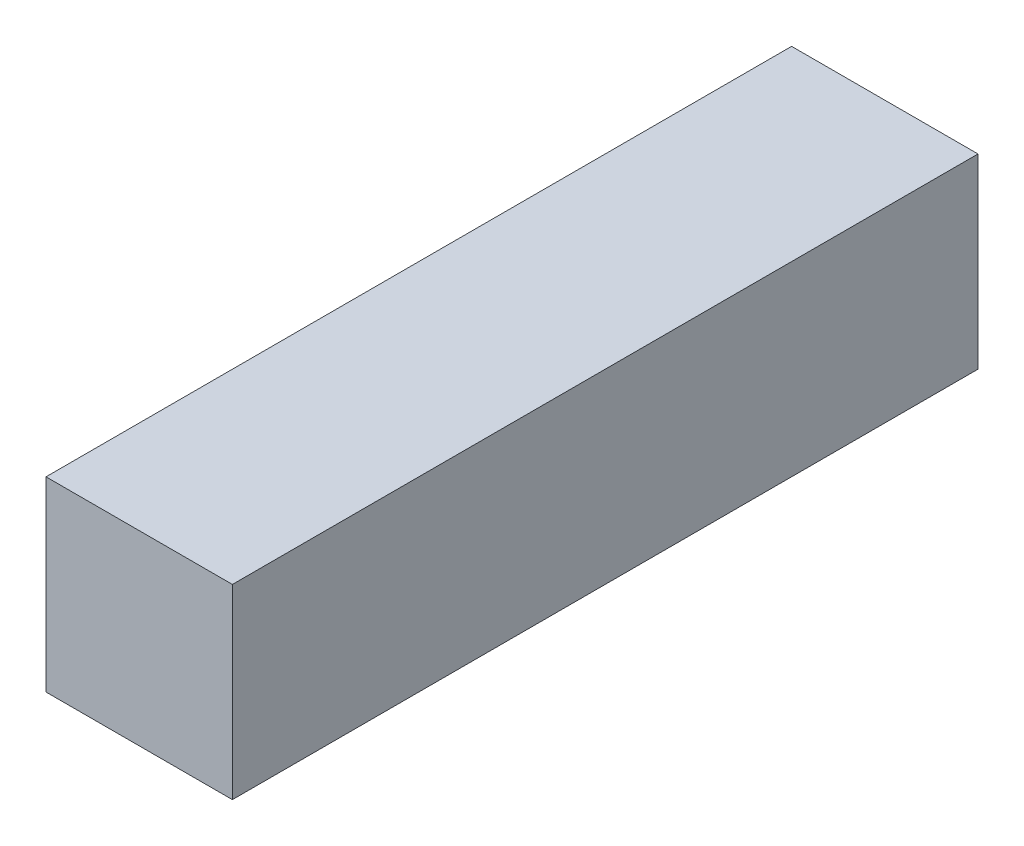
ISO-10303-21;
HEADER;
FILE_DESCRIPTION(('STEP AP214'),'2;1');
FILE_NAME('part.step','',(''),(''),'','','');
FILE_SCHEMA(('AUTOMOTIVE_DESIGN { 1 0 10303 214 1 1 1 1 }'));
ENDSEC;
DATA;
#1=APPLICATION_CONTEXT('core data for automotive mechanical design processes');
#2=APPLICATION_PROTOCOL_DEFINITION('international standard','automotive_design',2000,#1);
#3=PRODUCT_CONTEXT('',#1,'mechanical');
#4=PRODUCT('Part','Part','',(#3));
#5=PRODUCT_RELATED_PRODUCT_CATEGORY('part','',(#4));
#6=PRODUCT_DEFINITION_FORMATION('','',#4);
#7=PRODUCT_DEFINITION_CONTEXT('part definition',#1,'design');
#8=PRODUCT_DEFINITION('design','',#6,#7);
#9=PRODUCT_DEFINITION_SHAPE('','',#8);
#10=(LENGTH_UNIT() NAMED_UNIT(*) SI_UNIT(.MILLI.,.METRE.));
#11=(NAMED_UNIT(*) PLANE_ANGLE_UNIT() SI_UNIT($,.RADIAN.));
#12=(NAMED_UNIT(*) SI_UNIT($,.STERADIAN.) SOLID_ANGLE_UNIT());
#13=UNCERTAINTY_MEASURE_WITH_UNIT(LENGTH_MEASURE(1.E-05),#10,'distance_accuracy_value','');
#14=(GEOMETRIC_REPRESENTATION_CONTEXT(3) GLOBAL_UNCERTAINTY_ASSIGNED_CONTEXT((#13)) GLOBAL_UNIT_ASSIGNED_CONTEXT((#10,
#11,#12)) REPRESENTATION_CONTEXT('',''));
#15=CARTESIAN_POINT('',(0.,0.,0.));
#16=DIRECTION('',(0.,0.,1.));
#17=DIRECTION('',(1.,0.,0.));
#18=AXIS2_PLACEMENT_3D('',#15,#16,#17);
#19=CARTESIAN_POINT('',(-2.5,-2.5,20.));
#20=DIRECTION('',(1.,0.,0.));
#21=DIRECTION('',(0.,0.,-1.));
#22=AXIS2_PLACEMENT_3D('',#19,#20,#21);
#23=PLANE('',#22);
#24=DIRECTION('',(0.,-1.,0.));
#25=VECTOR('',#24,1.);
#26=CARTESIAN_POINT('',(-2.5,-2.5,0.));
#27=LINE('',#26,#25);
#28=CARTESIAN_POINT('',(-2.5,2.5,0.));
#29=VERTEX_POINT('',#28);
#30=CARTESIAN_POINT('',(-2.5,-2.5,0.));
#31=VERTEX_POINT('',#30);
#32=EDGE_CURVE('E96',#29,#31,#27,.T.);
#33=ORIENTED_EDGE('',*,*,#32,.T.);
#34=DIRECTION('',(0.,0.,-1.));
#35=VECTOR('',#34,1.);
#36=CARTESIAN_POINT('',(-2.5,-2.5,20.));
#37=LINE('',#36,#35);
#38=CARTESIAN_POINT('',(-2.5,-2.5,20.));
#39=VERTEX_POINT('',#38);
#40=EDGE_CURVE('E11',#39,#31,#37,.T.);
#41=ORIENTED_EDGE('',*,*,#40,.F.);
#42=DIRECTION('',(0.,-1.,0.));
#43=VECTOR('',#42,1.);
#44=CARTESIAN_POINT('',(-2.5,-2.5,20.));
#45=LINE('',#44,#43);
#46=CARTESIAN_POINT('',(-2.5,2.5,20.));
#47=VERTEX_POINT('',#46);
#48=EDGE_CURVE('E84',#47,#39,#45,.T.);
#49=ORIENTED_EDGE('',*,*,#48,.F.);
#50=DIRECTION('',(0.,0.,-1.));
#51=VECTOR('',#50,1.);
#52=CARTESIAN_POINT('',(-2.5,2.5,20.));
#53=LINE('',#52,#51);
#54=EDGE_CURVE('E92',#47,#29,#53,.T.);
#55=ORIENTED_EDGE('',*,*,#54,.T.);
#56=EDGE_LOOP('',(#33,#41,#49,#55));
#57=FACE_BOUND('',#56,.T.);
#58=ADVANCED_FACE('F33',(#57),#23,.F.);
#59=CARTESIAN_POINT('',(2.5,-2.5,20.));
#60=DIRECTION('',(0.,1.,0.));
#61=DIRECTION('',(-1.,0.,0.));
#62=AXIS2_PLACEMENT_3D('',#59,#60,#61);
#63=PLANE('',#62);
#64=DIRECTION('',(1.,0.,0.));
#65=VECTOR('',#64,1.);
#66=CARTESIAN_POINT('',(2.5,-2.5,0.));
#67=LINE('',#66,#65);
#68=CARTESIAN_POINT('',(2.5,-2.5,0.));
#69=VERTEX_POINT('',#68);
#70=EDGE_CURVE('E88',#31,#69,#67,.T.);
#71=ORIENTED_EDGE('',*,*,#70,.T.);
#72=DIRECTION('',(0.,0.,-1.));
#73=VECTOR('',#72,1.);
#74=CARTESIAN_POINT('',(2.5,-2.5,20.));
#75=LINE('',#74,#73);
#76=CARTESIAN_POINT('',(2.5,-2.5,20.));
#77=VERTEX_POINT('',#76);
#78=EDGE_CURVE('E41',#77,#69,#75,.T.);
#79=ORIENTED_EDGE('',*,*,#78,.F.);
#80=DIRECTION('',(1.,0.,0.));
#81=VECTOR('',#80,1.);
#82=CARTESIAN_POINT('',(2.5,-2.5,20.));
#83=LINE('',#82,#81);
#84=EDGE_CURVE('E79',#39,#77,#83,.T.);
#85=ORIENTED_EDGE('',*,*,#84,.F.);
#86=ORIENTED_EDGE('',*,*,#40,.T.);
#87=EDGE_LOOP('',(#71,#79,#85,#86));
#88=FACE_BOUND('',#87,.T.);
#89=ADVANCED_FACE('F87',(#88),#63,.F.);
#90=CARTESIAN_POINT('',(2.5,-2.5,20.));
#91=DIRECTION('',(-1.,0.,0.));
#92=DIRECTION('',(0.,-1.,0.));
#93=AXIS2_PLACEMENT_3D('',#90,#91,#92);
#94=PLANE('',#93);
#95=DIRECTION('',(0.,1.,0.));
#96=VECTOR('',#95,1.);
#97=CARTESIAN_POINT('',(2.5,-2.5,0.));
#98=LINE('',#97,#96);
#99=CARTESIAN_POINT('',(2.5,2.5,0.));
#100=VERTEX_POINT('',#99);
#101=EDGE_CURVE('E66',#69,#100,#98,.T.);
#102=ORIENTED_EDGE('',*,*,#101,.T.);
#103=DIRECTION('',(0.,0.,-1.));
#104=VECTOR('',#103,1.);
#105=CARTESIAN_POINT('',(2.5,2.5,20.));
#106=LINE('',#105,#104);
#107=CARTESIAN_POINT('',(2.5,2.5,20.));
#108=VERTEX_POINT('',#107);
#109=EDGE_CURVE('E89',#108,#100,#106,.T.);
#110=ORIENTED_EDGE('',*,*,#109,.F.);
#111=DIRECTION('',(0.,1.,0.));
#112=VECTOR('',#111,1.);
#113=CARTESIAN_POINT('',(2.5,-2.5,20.));
#114=LINE('',#113,#112);
#115=EDGE_CURVE('E82',#77,#108,#114,.T.);
#116=ORIENTED_EDGE('',*,*,#115,.F.);
#117=ORIENTED_EDGE('',*,*,#78,.T.);
#118=EDGE_LOOP('',(#102,#110,#116,#117));
#119=FACE_BOUND('',#118,.T.);
#120=ADVANCED_FACE('F90',(#119),#94,.F.);
#121=CARTESIAN_POINT('',(2.5,2.5,20.));
#122=DIRECTION('',(0.,-1.,0.));
#123=DIRECTION('',(1.,0.,0.));
#124=AXIS2_PLACEMENT_3D('',#121,#122,#123);
#125=PLANE('',#124);
#126=DIRECTION('',(-1.,0.,0.));
#127=VECTOR('',#126,1.);
#128=CARTESIAN_POINT('',(2.5,2.5,0.));
#129=LINE('',#128,#127);
#130=EDGE_CURVE('E72',#100,#29,#129,.T.);
#131=ORIENTED_EDGE('',*,*,#130,.T.);
#132=ORIENTED_EDGE('',*,*,#54,.F.);
#133=DIRECTION('',(-1.,0.,0.));
#134=VECTOR('',#133,1.);
#135=CARTESIAN_POINT('',(2.5,2.5,20.));
#136=LINE('',#135,#134);
#137=EDGE_CURVE('E49',#108,#47,#136,.T.);
#138=ORIENTED_EDGE('',*,*,#137,.F.);
#139=ORIENTED_EDGE('',*,*,#109,.T.);
#140=EDGE_LOOP('',(#131,#132,#138,#139));
#141=FACE_BOUND('',#140,.T.);
#142=ADVANCED_FACE('F103',(#141),#125,.F.);
#143=CARTESIAN_POINT('',(0.,0.,20.));
#144=DIRECTION('',(0.,0.,1.));
#145=DIRECTION('',(1.,0.,0.));
#146=AXIS2_PLACEMENT_3D('',#143,#144,#145);
#147=PLANE('',#146);
#148=ORIENTED_EDGE('',*,*,#48,.T.);
#149=ORIENTED_EDGE('',*,*,#84,.T.);
#150=ORIENTED_EDGE('',*,*,#115,.T.);
#151=ORIENTED_EDGE('',*,*,#137,.T.);
#152=EDGE_LOOP('',(#148,#149,#150,#151));
#153=FACE_BOUND('',#152,.T.);
#154=ADVANCED_FACE('F80',(#153),#147,.T.);
#155=CARTESIAN_POINT('',(0.,0.,0.));
#156=DIRECTION('',(0.,0.,1.));
#157=DIRECTION('',(1.,0.,0.));
#158=AXIS2_PLACEMENT_3D('',#155,#156,#157);
#159=PLANE('',#158);
#160=ORIENTED_EDGE('',*,*,#32,.F.);
#161=ORIENTED_EDGE('',*,*,#130,.F.);
#162=ORIENTED_EDGE('',*,*,#101,.F.);
#163=ORIENTED_EDGE('',*,*,#70,.F.);
#164=EDGE_LOOP('',(#160,#161,#162,#163));
#165=FACE_BOUND('',#164,.T.);
#166=ADVANCED_FACE('F106',(#165),#159,.F.);
#167=CLOSED_SHELL('',(#58,#89,#120,#142,#154,#166));
#168=MANIFOLD_SOLID_BREP('B2',#167);
#169=ADVANCED_BREP_SHAPE_REPRESENTATION('',(#18,#168),#14);
#170=SHAPE_DEFINITION_REPRESENTATION(#9,#169);
ENDSEC;
END-ISO-10303-21;
